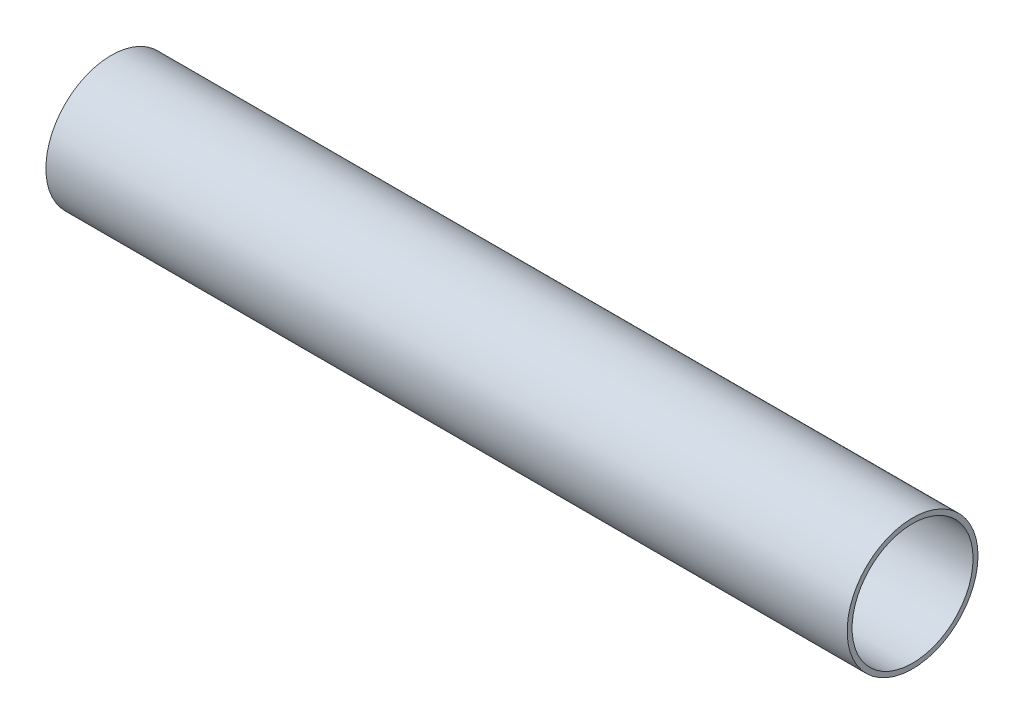
ISO-10303-21;
HEADER;
FILE_DESCRIPTION(('STEP AP214'),'2;1');
FILE_NAME('part.step','',(''),(''),'','','');
FILE_SCHEMA(('AUTOMOTIVE_DESIGN { 1 0 10303 214 1 1 1 1 }'));
ENDSEC;
DATA;
#1=APPLICATION_CONTEXT('core data for automotive mechanical design processes');
#2=APPLICATION_PROTOCOL_DEFINITION('international standard','automotive_design',2000,#1);
#3=PRODUCT_CONTEXT('',#1,'mechanical');
#4=PRODUCT('Part','Part','',(#3));
#5=PRODUCT_RELATED_PRODUCT_CATEGORY('part','',(#4));
#6=PRODUCT_DEFINITION_FORMATION('','',#4);
#7=PRODUCT_DEFINITION_CONTEXT('part definition',#1,'design');
#8=PRODUCT_DEFINITION('design','',#6,#7);
#9=PRODUCT_DEFINITION_SHAPE('','',#8);
#10=(LENGTH_UNIT() NAMED_UNIT(*) SI_UNIT(.MILLI.,.METRE.));
#11=(NAMED_UNIT(*) PLANE_ANGLE_UNIT() SI_UNIT($,.RADIAN.));
#12=(NAMED_UNIT(*) SI_UNIT($,.STERADIAN.) SOLID_ANGLE_UNIT());
#13=UNCERTAINTY_MEASURE_WITH_UNIT(LENGTH_MEASURE(1.E-05),#10,'distance_accuracy_value','');
#14=(GEOMETRIC_REPRESENTATION_CONTEXT(3) GLOBAL_UNCERTAINTY_ASSIGNED_CONTEXT((#13)) GLOBAL_UNIT_ASSIGNED_CONTEXT((#10,
#11,#12)) REPRESENTATION_CONTEXT('',''));
#15=CARTESIAN_POINT('',(0.,0.,0.));
#16=DIRECTION('',(0.,0.,1.));
#17=DIRECTION('',(1.,0.,0.));
#18=AXIS2_PLACEMENT_3D('',#15,#16,#17);
#19=CARTESIAN_POINT('',(105.156,0.,0.));
#20=DIRECTION('',(1.,0.,0.));
#21=DIRECTION('',(0.,0.,-1.));
#22=AXIS2_PLACEMENT_3D('',#19,#20,#21);
#23=PLANE('',#22);
#24=CARTESIAN_POINT('',(105.156,0.,0.));
#25=DIRECTION('',(1.,0.,0.));
#26=DIRECTION('',(0.,0.,-1.));
#27=AXIS2_PLACEMENT_3D('',#24,#25,#26);
#28=CIRCLE('',#27,17.1714379493972);
#29=CARTESIAN_POINT('',(105.156,0.,-17.1714379493972));
#30=VERTEX_POINT('',#29);
#31=EDGE_CURVE('E10',#30,#30,#28,.T.);
#32=ORIENTED_EDGE('',*,*,#31,.T.);
#33=EDGE_LOOP('',(#32));
#34=FACE_BOUND('',#33,.T.);
#35=CARTESIAN_POINT('',(105.156,0.,0.));
#36=DIRECTION('',(1.,0.,0.));
#37=DIRECTION('',(0.,0.,-1.));
#38=AXIS2_PLACEMENT_3D('',#35,#36,#37);
#39=CIRCLE('',#38,15.875);
#40=CARTESIAN_POINT('',(105.156,0.,-15.875));
#41=VERTEX_POINT('',#40);
#42=EDGE_CURVE('E54',#41,#41,#39,.T.);
#43=ORIENTED_EDGE('',*,*,#42,.F.);
#44=EDGE_LOOP('',(#43));
#45=FACE_BOUND('',#44,.T.);
#46=ADVANCED_FACE('F41',(#34,#45),#23,.T.);
#47=CARTESIAN_POINT('',(-105.156,0.,0.));
#48=DIRECTION('',(1.,0.,0.));
#49=DIRECTION('',(0.,0.,-1.));
#50=AXIS2_PLACEMENT_3D('',#47,#48,#49);
#51=PLANE('',#50);
#52=CARTESIAN_POINT('',(-105.156,0.,0.));
#53=DIRECTION('',(1.,0.,0.));
#54=DIRECTION('',(0.,0.,-1.));
#55=AXIS2_PLACEMENT_3D('',#52,#53,#54);
#56=CIRCLE('',#55,17.1714379493972);
#57=CARTESIAN_POINT('',(-105.156,0.,-17.1714379493972));
#58=VERTEX_POINT('',#57);
#59=EDGE_CURVE('E45',#58,#58,#56,.T.);
#60=ORIENTED_EDGE('',*,*,#59,.F.);
#61=EDGE_LOOP('',(#60));
#62=FACE_BOUND('',#61,.T.);
#63=CARTESIAN_POINT('',(-105.156,0.,0.));
#64=DIRECTION('',(1.,0.,0.));
#65=DIRECTION('',(0.,0.,-1.));
#66=AXIS2_PLACEMENT_3D('',#63,#64,#65);
#67=CIRCLE('',#66,15.875);
#68=CARTESIAN_POINT('',(-105.156,0.,-15.875));
#69=VERTEX_POINT('',#68);
#70=EDGE_CURVE('E56',#69,#69,#67,.T.);
#71=ORIENTED_EDGE('',*,*,#70,.T.);
#72=EDGE_LOOP('',(#71));
#73=FACE_BOUND('',#72,.T.);
#74=ADVANCED_FACE('F68',(#62,#73),#51,.F.);
#75=CARTESIAN_POINT('',(105.156,0.,0.));
#76=DIRECTION('',(-1.,0.,0.));
#77=DIRECTION('',(0.,0.,1.));
#78=AXIS2_PLACEMENT_3D('',#75,#76,#77);
#79=CYLINDRICAL_SURFACE('',#78,17.1714379493972);
#80=ORIENTED_EDGE('',*,*,#31,.F.);
#81=EDGE_LOOP('',(#80));
#82=FACE_BOUND('',#81,.T.);
#83=ORIENTED_EDGE('',*,*,#59,.T.);
#84=EDGE_LOOP('',(#83));
#85=FACE_BOUND('',#84,.T.);
#86=ADVANCED_FACE('F43',(#82,#85),#79,.T.);
#87=CARTESIAN_POINT('',(105.156,0.,0.));
#88=DIRECTION('',(-1.,0.,0.));
#89=DIRECTION('',(0.,0.,1.));
#90=AXIS2_PLACEMENT_3D('',#87,#88,#89);
#91=CYLINDRICAL_SURFACE('',#90,15.875);
#92=ORIENTED_EDGE('',*,*,#42,.T.);
#93=EDGE_LOOP('',(#92));
#94=FACE_BOUND('',#93,.T.);
#95=ORIENTED_EDGE('',*,*,#70,.F.);
#96=EDGE_LOOP('',(#95));
#97=FACE_BOUND('',#96,.T.);
#98=ADVANCED_FACE('F64',(#94,#97),#91,.F.);
#99=CLOSED_SHELL('',(#46,#74,#86,#98));
#100=MANIFOLD_SOLID_BREP('B2',#99);
#101=ADVANCED_BREP_SHAPE_REPRESENTATION('',(#18,#100),#14);
#102=SHAPE_DEFINITION_REPRESENTATION(#9,#101);
ENDSEC;
END-ISO-10303-21;
